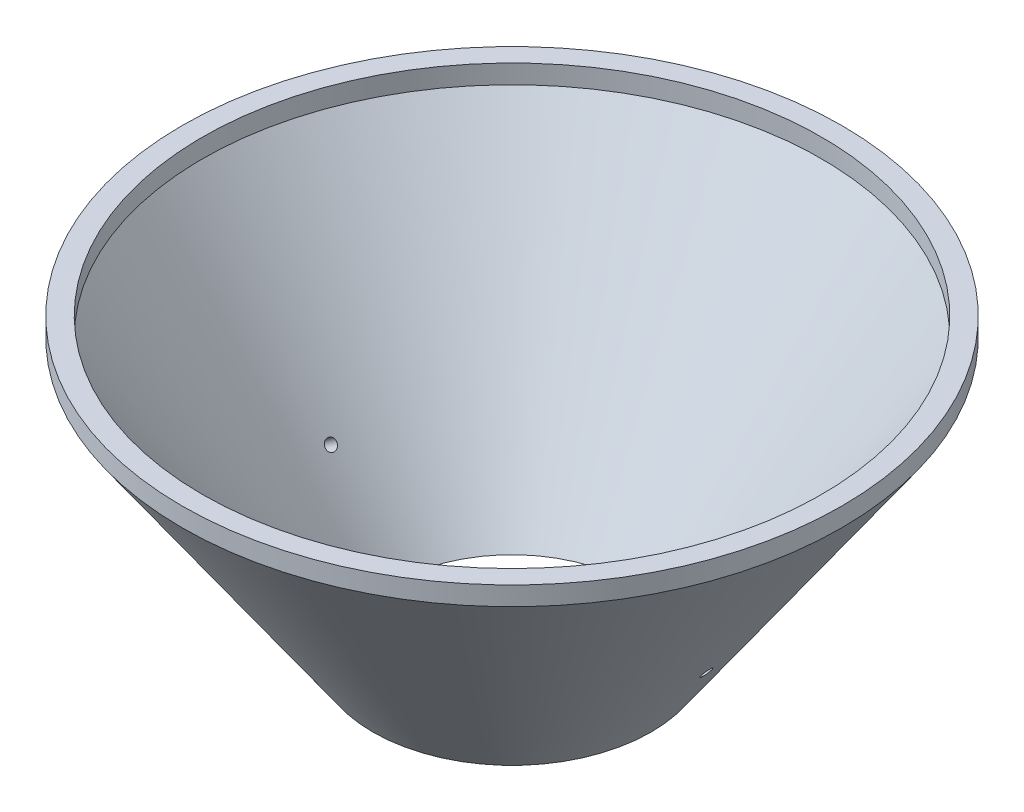
ISO-10303-21;
HEADER;
FILE_DESCRIPTION(('STEP AP214'),'2;1');
FILE_NAME('part.step','',(''),(''),'','','');
FILE_SCHEMA(('AUTOMOTIVE_DESIGN { 1 0 10303 214 1 1 1 1 }'));
ENDSEC;
DATA;
#1=APPLICATION_CONTEXT('core data for automotive mechanical design processes');
#2=APPLICATION_PROTOCOL_DEFINITION('international standard','automotive_design',2000,#1);
#3=PRODUCT_CONTEXT('',#1,'mechanical');
#4=PRODUCT('Part','Part','',(#3));
#5=PRODUCT_RELATED_PRODUCT_CATEGORY('part','',(#4));
#6=PRODUCT_DEFINITION_FORMATION('','',#4);
#7=PRODUCT_DEFINITION_CONTEXT('part definition',#1,'design');
#8=PRODUCT_DEFINITION('design','',#6,#7);
#9=PRODUCT_DEFINITION_SHAPE('','',#8);
#10=(LENGTH_UNIT() NAMED_UNIT(*) SI_UNIT(.MILLI.,.METRE.));
#11=(NAMED_UNIT(*) PLANE_ANGLE_UNIT() SI_UNIT($,.RADIAN.));
#12=(NAMED_UNIT(*) SI_UNIT($,.STERADIAN.) SOLID_ANGLE_UNIT());
#13=UNCERTAINTY_MEASURE_WITH_UNIT(LENGTH_MEASURE(1.E-05),#10,'distance_accuracy_value','');
#14=(GEOMETRIC_REPRESENTATION_CONTEXT(3) GLOBAL_UNCERTAINTY_ASSIGNED_CONTEXT((#13)) GLOBAL_UNIT_ASSIGNED_CONTEXT((#10,
#11,#12)) REPRESENTATION_CONTEXT('',''));
#15=CARTESIAN_POINT('',(0.,0.,0.));
#16=DIRECTION('',(0.,0.,1.));
#17=DIRECTION('',(1.,0.,0.));
#18=AXIS2_PLACEMENT_3D('',#15,#16,#17);
#19=CARTESIAN_POINT('',(0.,0.,0.));
#20=DIRECTION('',(0.,1.,0.));
#21=DIRECTION('',(0.,0.,1.));
#22=AXIS2_PLACEMENT_3D('',#19,#20,#21);
#23=CONICAL_SURFACE('',#22,12.63,0.610865238198013);
#24=CARTESIAN_POINT('',(18.9409920304637,9.0174198213227,-0.341221752310357));
#25=CARTESIAN_POINT('',(18.9516528807942,9.03335579514401,-0.368943909328451));
#26=CARTESIAN_POINT('',(18.9636435000784,9.05123552282013,-0.395067037450147));
#27=CARTESIAN_POINT('',(18.9899743840398,9.09035338379973,-0.443349914106763));
#28=CARTESIAN_POINT('',(19.0043174497796,9.1115955196641,-0.46550487112919));
#29=CARTESIAN_POINT('',(19.0349633828263,9.15679390072063,-0.50518849983412));
#30=CARTESIAN_POINT('',(19.0512653268974,9.18074886702915,-0.522719338550814));
#31=CARTESIAN_POINT('',(19.0853931640646,9.23067439551349,-0.552662840553578));
#32=CARTESIAN_POINT('',(19.1032186768391,9.25664445452258,-0.565076776669664));
#33=CARTESIAN_POINT('',(19.1399109995928,9.30985368090246,-0.584440567537121));
#34=CARTESIAN_POINT('',(19.1587777706456,9.33709280082461,-0.591390626402793));
#35=CARTESIAN_POINT('',(19.1970293725544,9.3920606076407,-0.599629592854147));
#36=CARTESIAN_POINT('',(19.2164142227705,9.41978931281673,-0.60091828858248));
#37=CARTESIAN_POINT('',(19.2551462793119,9.47493881765334,-0.597797819956837));
#38=CARTESIAN_POINT('',(19.2744934948745,9.50235970373208,-0.5933902972853));
#39=CARTESIAN_POINT('',(19.3125978896348,9.55612948038676,-0.57900559997575));
#40=CARTESIAN_POINT('',(19.3313550697851,9.58247837269348,-0.569028434330533));
#41=CARTESIAN_POINT('',(19.3677306271828,9.6333705038294,-0.543787270498572));
#42=CARTESIAN_POINT('',(19.3853489389023,9.65791363877063,-0.528522968422768));
#43=CARTESIAN_POINT('',(19.418921477716,9.70451373168668,-0.493141031359008));
#44=CARTESIAN_POINT('',(19.4348757045594,9.72657068928652,-0.473023395639035));
#45=CARTESIAN_POINT('',(19.4646436210162,9.76759906631192,-0.428498929059879));
#46=CARTESIAN_POINT('',(19.478456690162,9.78656959142533,-0.4040908592689));
#47=CARTESIAN_POINT('',(19.5035154908795,9.82089977862868,-0.351681822803493));
#48=CARTESIAN_POINT('',(19.5147612184523,9.83625943509415,-0.323680850532673));
#49=CARTESIAN_POINT('',(19.5343397661102,9.86295178733934,-0.264878076519695));
#50=CARTESIAN_POINT('',(19.542672364744,9.87428417697388,-0.234076062071064));
#51=CARTESIAN_POINT('',(19.5561648101363,9.89261354016702,-0.170547348437315));
#52=CARTESIAN_POINT('',(19.5613246634901,9.89961052273778,-0.137820653253258));
#53=CARTESIAN_POINT('',(19.5683097414493,9.90907886567705,-0.0713802071735974));
#54=CARTESIAN_POINT('',(19.5701357893078,9.9115513433315,-0.0376667020516758));
#55=CARTESIAN_POINT('',(19.5703986409376,9.91190736541768,0.0297977072534086));
#56=CARTESIAN_POINT('',(19.5688354486134,9.90979091513603,0.0635486113934413));
#57=CARTESIAN_POINT('',(19.5623693554034,9.90102703926073,0.130123075161604));
#58=CARTESIAN_POINT('',(19.5574670852682,9.89438046940477,0.16294680871252));
#59=CARTESIAN_POINT('',(19.5444764066079,9.87673666923223,0.226742209433611));
#60=CARTESIAN_POINT('',(19.5363879948134,9.86573943445126,0.257713874703264));
#61=CARTESIAN_POINT('',(19.5172744794256,9.83968964124902,0.316931433895236));
#62=CARTESIAN_POINT('',(19.5062489125108,9.82463644301547,0.345176896814268));
#63=CARTESIAN_POINT('',(19.4816012673562,9.79088395687603,0.398135619957056));
#64=CARTESIAN_POINT('',(19.4679791843011,9.77218466220844,0.422848873630181));
#65=CARTESIAN_POINT('',(19.4385502170128,9.73164438878141,0.468048391004436));
#66=CARTESIAN_POINT('',(19.4227427576482,9.70980258293727,0.488533538434191));
#67=CARTESIAN_POINT('',(19.3894229293304,9.66358050446548,0.52468719199105));
#68=CARTESIAN_POINT('',(19.3719105610265,9.63920023280481,0.540355699952948));
#69=CARTESIAN_POINT('',(19.3357034543183,9.58857652416262,0.566430488966749));
#70=CARTESIAN_POINT('',(19.3170087596836,9.56233315614849,0.576836964690844));
#71=CARTESIAN_POINT('',(19.278985518405,9.50871473112502,0.592092607309416));
#72=CARTESIAN_POINT('',(19.2596569727668,9.48133967591143,0.596941783021795));
#73=CARTESIAN_POINT('',(19.2209301853392,9.4262367058419,0.600944259560997));
#74=CARTESIAN_POINT('',(19.2015319651402,9.39850889449174,0.600099194398644));
#75=CARTESIAN_POINT('',(19.1632107021641,9.34348033562615,0.592741075740981));
#76=CARTESIAN_POINT('',(19.1442876585822,9.31617958738738,0.586228031846972));
#77=CARTESIAN_POINT('',(19.1074451751407,9.26279002378878,0.567720083972553));
#78=CARTESIAN_POINT('',(19.0895256394528,9.23670109274913,0.555725704428883));
#79=CARTESIAN_POINT('',(19.0551769514751,9.18648596264801,0.526595960401006));
#80=CARTESIAN_POINT('',(19.0387478044656,9.16235977054041,0.50946057770349));
#81=CARTESIAN_POINT('',(19.0078154886344,9.11676697764842,0.470530262506523));
#82=CARTESIAN_POINT('',(18.9933127988557,9.09530103846516,0.44873417455488));
#83=CARTESIAN_POINT('',(18.9666191084016,9.05566563167151,0.401103215934936));
#84=CARTESIAN_POINT('',(18.954428115545,9.03749617521055,0.375268331607078));
#85=CARTESIAN_POINT('',(18.932670497573,9.00498708154816,0.320286275363405));
#86=CARTESIAN_POINT('',(18.9231044593827,8.99064830088309,0.29113836473067));
#87=CARTESIAN_POINT('',(18.9068448344701,8.9662330439194,0.230363159170827));
#88=CARTESIAN_POINT('',(18.9001511322964,8.95615639630751,0.198735963957302));
#89=CARTESIAN_POINT('',(18.8898061164297,8.94056790092257,0.133908223698161));
#90=CARTESIAN_POINT('',(18.8861539701373,8.93505480391981,0.100708111856573));
#91=CARTESIAN_POINT('',(18.8819804712424,8.92875382241925,0.0336597777743034));
#92=CARTESIAN_POINT('',(18.8814598860175,8.92796709610127,-0.00018860128355528));
#93=CARTESIAN_POINT('',(18.8835636636255,8.93114416410418,-0.0675665199245226));
#94=CARTESIAN_POINT('',(18.8861886374448,8.93510888133485,-0.101095996289468));
#95=CARTESIAN_POINT('',(18.8945180001919,8.94767030676081,-0.166851548132623));
#96=CARTESIAN_POINT('',(18.9002187055197,8.95626147413967,-0.199079133274328));
#97=CARTESIAN_POINT('',(18.9118670403593,8.97377563061058,-0.249700905151459));
#98=CARTESIAN_POINT('',(18.9169294507424,8.98137959517991,-0.268771196420281));
#99=CARTESIAN_POINT('',(18.9281511365663,8.9982078066753,-0.305844279334317));
#100=CARTESIAN_POINT('',(18.9343104119751,9.00743205355399,-0.323847071010732));
#101=CARTESIAN_POINT('',(18.9409920304637,9.0174198213227,-0.341221752310357));
#102=B_SPLINE_CURVE_WITH_KNOTS('',3,(#24,#25,#26,#27,#28,#29,#30,#31,#32,#33,#34,#35,#36,#37,
#38,#39,#40,#41,#42,#43,#44,#45,#46,#47,#48,#49,#50,#51,#52,#53,#54,#55,#56,#57,#58,#59,#60,#61,
#62,#63,#64,#65,#66,#67,#68,#69,#70,#71,#72,#73,#74,#75,#76,#77,#78,#79,#80,#81,#82,#83,#84,#85,
#86,#87,#88,#89,#90,#91,#92,#93,#94,#95,#96,#97,#98,#99,#100,#101),.UNSPECIFIED.,.T.,.F.,(4,2,2,
2,2,2,2,2,2,2,2,2,2,2,2,2,2,2,2,2,2,2,2,2,2,2,2,2,2,2,2,2,2,2,2,2,2,2,4),(0.,0.10104235923319,
0.202205915079846,0.303321977342182,0.404412871772923,0.505499989567226,0.60659089017245,
0.707652662303126,0.808714271259004,0.909781689903222,1.01084912379122,1.11194579061356,
1.21304261490842,1.31414712274877,1.41525142041871,1.51633074791722,1.61740995896861,
1.71847008148962,1.81953030771289,1.9206064851317,2.02168284999809,2.12278586621353,
2.22388884391595,2.32498808097644,2.42608715762013,2.52715722426009,2.62822711969221,
2.72928734710247,2.83034793254847,2.93143360139531,3.03251961213003,3.13362820674222,
3.23473273698328,3.33580958163436,3.43691119378623,3.53803244687288,3.63903286168514,
3.70236050388859,3.76568814424114),.UNSPECIFIED.);
#103=CARTESIAN_POINT('',(18.9409920304637,9.0174198213227,-0.341221752310357));
#104=VERTEX_POINT('',#103);
#105=EDGE_CURVE('E58',#104,#104,#102,.T.);
#106=ORIENTED_EDGE('',*,*,#105,.T.);
#107=EDGE_LOOP('',(#106));
#108=FACE_BOUND('',#107,.T.);
#109=CARTESIAN_POINT('',(0.,28.8966390184844,0.));
#110=DIRECTION('',(0.,1.,0.));
#111=DIRECTION('',(0.,0.,1.));
#112=AXIS2_PLACEMENT_3D('',#109,#110,#111);
#113=CIRCLE('',#112,32.8636444696675);
#114=CARTESIAN_POINT('',(0.,28.8966390184844,32.8636444696675));
#115=VERTEX_POINT('',#114);
#116=EDGE_CURVE('E99',#115,#115,#113,.T.);
#117=ORIENTED_EDGE('',*,*,#116,.T.);
#118=EDGE_LOOP('',(#117));
#119=FACE_BOUND('',#118,.T.);
#120=CARTESIAN_POINT('',(0.,0.,0.));
#121=DIRECTION('',(0.,1.,0.));
#122=DIRECTION('',(0.,0.,1.));
#123=AXIS2_PLACEMENT_3D('',#120,#121,#122);
#124=CIRCLE('',#123,12.63);
#125=CARTESIAN_POINT('',(0.,0.,12.63));
#126=VERTEX_POINT('',#125);
#127=EDGE_CURVE('E10',#126,#126,#124,.T.);
#128=ORIENTED_EDGE('',*,*,#127,.F.);
#129=EDGE_LOOP('',(#128));
#130=FACE_BOUND('',#129,.T.);
#131=CARTESIAN_POINT('',(-19.4175885176777,9.70263879091387,-0.493584225455072));
#132=CARTESIAN_POINT('',(-19.401358281771,9.68016229249148,-0.512741554706572));
#133=CARTESIAN_POINT('',(-19.3842083219253,9.6563303550641,-0.529572307843523));
#134=CARTESIAN_POINT('',(-19.3485868387306,9.60662035558906,-0.558080314798091));
#135=CARTESIAN_POINT('',(-19.3301137610521,9.58073988315152,-0.569751387967737));
#136=CARTESIAN_POINT('',(-19.2924106182585,9.52768117822797,-0.587585099760744));
#137=CARTESIAN_POINT('',(-19.2731809071034,9.5005035513244,-0.593750282841554));
#138=CARTESIAN_POINT('',(-19.2345210675658,9.44561254210044,-0.60040235203029));
#139=CARTESIAN_POINT('',(-19.2150909900072,9.41789929415578,-0.60089064429087));
#140=CARTESIAN_POINT('',(-19.1765805091088,9.36271767045297,-0.596179631487159));
#141=CARTESIAN_POINT('',(-19.1575000758947,9.33524927387818,-0.590980814666784));
#142=CARTESIAN_POINT('',(-19.1202199661323,9.28133946924398,-0.575043678832522));
#143=CARTESIAN_POINT('',(-19.1020203243432,9.25489810172281,-0.564305141396735));
#144=CARTESIAN_POINT('',(-19.0670007646207,9.20380503618891,-0.537593195567367));
#145=CARTESIAN_POINT('',(-19.0501808948431,9.17915340064377,-0.521619604560233));
#146=CARTESIAN_POINT('',(-19.0183735379543,9.1323573899341,-0.484891136578403));
#147=CARTESIAN_POINT('',(-19.0033860509059,9.11021301485563,-0.464136259439587));
#148=CARTESIAN_POINT('',(-18.9756344886406,9.06907390168621,-0.418427061129773));
#149=CARTESIAN_POINT('',(-18.9628710739623,9.05008009938014,-0.393471496686931));
#150=CARTESIAN_POINT('',(-18.939904237595,9.01581068222032,-0.340073127500658));
#151=CARTESIAN_POINT('',(-18.9297008124928,9.00053506240915,-0.311630327406787));
#152=CARTESIAN_POINT('',(-18.9121143372266,8.97415475073057,-0.252062134454907));
#153=CARTESIAN_POINT('',(-18.9047314879638,8.963050355968,-0.220936550703678));
#154=CARTESIAN_POINT('',(-18.892974144582,8.94534574379358,-0.156888039060695));
#155=CARTESIAN_POINT('',(-18.8885996478745,8.93874552250618,-0.123965112715464));
#156=CARTESIAN_POINT('',(-18.8829697752905,8.93024833907432,-0.0572661068152085));
#157=CARTESIAN_POINT('',(-18.88171355048,8.92835009683969,-0.0234902619930935));
#158=CARTESIAN_POINT('',(-18.8823492238672,8.92931015662237,0.0439640183005182));
#159=CARTESIAN_POINT('',(-18.884241116928,8.93216845087811,0.0776424539308742));
#160=CARTESIAN_POINT('',(-18.8911249580144,8.94255477241331,0.143939432796078));
#161=CARTESIAN_POINT('',(-18.8961163315958,8.95008193438496,0.176558171252002));
#162=CARTESIAN_POINT('',(-18.9090730812844,8.96957984270636,0.239816878822746));
#163=CARTESIAN_POINT('',(-18.9170384619207,8.9815505958233,0.270456844923987));
#164=CARTESIAN_POINT('',(-18.9357432063248,9.00958157393837,0.328894924715401));
#165=CARTESIAN_POINT('',(-18.9464831155053,9.02564260298794,0.35669247814703));
#166=CARTESIAN_POINT('',(-18.970460820221,9.06137671622385,0.4086507102759));
#167=CARTESIAN_POINT('',(-18.9836986200892,9.08104980667595,0.432811382664185));
#168=CARTESIAN_POINT('',(-19.0123315442464,9.12343413798413,0.476816578324767));
#169=CARTESIAN_POINT('',(-19.0277272398111,9.14614618329266,0.496659955085495));
#170=CARTESIAN_POINT('',(-19.0602655580122,9.19393973603782,0.531459066221772));
#171=CARTESIAN_POINT('',(-19.0774081796317,9.2190212420951,0.546414803442524));
#172=CARTESIAN_POINT('',(-19.1129760667955,9.27082307710547,0.571012621441635));
#173=CARTESIAN_POINT('',(-19.1314012238735,9.29754326744929,0.580655150954382));
#174=CARTESIAN_POINT('',(-19.1690280768323,9.35185460362497,0.594354225016952));
#175=CARTESIAN_POINT('',(-19.1882297710721,9.37944574761612,0.598410781371617));
#176=CARTESIAN_POINT('',(-19.2268647405924,9.434702791546,0.600822152710127));
#177=CARTESIAN_POINT('',(-19.2462979461925,9.46236866714562,0.599178642151331));
#178=CARTESIAN_POINT('',(-19.2848457570536,9.51700060842801,0.590240368933641));
#179=CARTESIAN_POINT('',(-19.3039603622603,9.54396667399159,0.582945605312336));
#180=CARTESIAN_POINT('',(-19.3413141486674,9.59644210410574,0.562912646850214));
#181=CARTESIAN_POINT('',(-19.3595533642712,9.62195152591124,0.550174666127982));
#182=CARTESIAN_POINT('',(-19.3946183905132,9.67080636420266,0.51961711258294));
#183=CARTESIAN_POINT('',(-19.4114442000467,9.69415177899725,0.501797535788529));
#184=CARTESIAN_POINT('',(-19.4431827994753,9.73804158398757,0.461576916617099));
#185=CARTESIAN_POINT('',(-19.4580950704815,9.75858521452563,0.439174635815023));
#186=CARTESIAN_POINT('',(-19.4855489809308,9.79630193869703,0.390427016085139));
#187=CARTESIAN_POINT('',(-19.4980906135772,9.8134750226669,0.364081665852811));
#188=CARTESIAN_POINT('',(-19.5204205628929,9.8439857706707,0.308190656279575));
#189=CARTESIAN_POINT('',(-19.5302084420283,9.85732282521922,0.2786444894042));
#190=CARTESIAN_POINT('',(-19.5467254797967,9.87979628462473,0.217193693033975));
#191=CARTESIAN_POINT('',(-19.5534546363181,9.88893268658159,0.185289061910854));
#192=CARTESIAN_POINT('',(-19.5636438208904,9.90275656631891,0.120032900465693));
#193=CARTESIAN_POINT('',(-19.5671044128359,9.90744481149837,0.0866816207590241));
#194=CARTESIAN_POINT('',(-19.5706501951097,9.91224837987877,0.0194754291026961));
#195=CARTESIAN_POINT('',(-19.5707355226306,9.9123638889451,-0.0143794623209883));
#196=CARTESIAN_POINT('',(-19.5675291615335,9.90802030192253,-0.0816206311640796));
#197=CARTESIAN_POINT('',(-19.5642386524977,9.90356280373027,-0.115007068139819));
#198=CARTESIAN_POINT('',(-19.5543834728714,9.89019352288147,-0.180384920454303));
#199=CARTESIAN_POINT('',(-19.5478179925184,9.88128063859445,-0.212375988648697));
#200=CARTESIAN_POINT('',(-19.531614290467,9.8592374837752,-0.274060674640528));
#201=CARTESIAN_POINT('',(-19.5219743808316,9.84610489649272,-0.303753019227275));
#202=CARTESIAN_POINT('',(-19.499927230821,9.81598787016023,-0.359954749885987));
#203=CARTESIAN_POINT('',(-19.4875233058232,9.79900804538287,-0.386467891226359));
#204=CARTESIAN_POINT('',(-19.4654082770515,9.76863542846856,-0.426421010043452));
#205=CARTESIAN_POINT('',(-19.4564143963297,9.75626138418274,-0.44105271640314));
#206=CARTESIAN_POINT('',(-19.4375972560163,9.73031576317857,-0.46862311899238));
#207=CARTESIAN_POINT('',(-19.4277739961247,9.716744186027,-0.481561814609454));
#208=CARTESIAN_POINT('',(-19.4175885176777,9.70263879091387,-0.493584225455072));
#209=B_SPLINE_CURVE_WITH_KNOTS('',3,(#131,#132,#133,#134,#135,#136,#137,#138,#139,#140,#141,
#142,#143,#144,#145,#146,#147,#148,#149,#150,#151,#152,#153,#154,#155,#156,#157,#158,#159,#160,
#161,#162,#163,#164,#165,#166,#167,#168,#169,#170,#171,#172,#173,#174,#175,#176,#177,#178,#179,
#180,#181,#182,#183,#184,#185,#186,#187,#188,#189,#190,#191,#192,#193,#194,#195,#196,#197,#198,
#199,#200,#201,#202,#203,#204,#205,#206,#207,#208),.UNSPECIFIED.,.T.,.F.,(4,2,2,2,2,2,2,2,2,2,2,
2,2,2,2,2,2,2,2,2,2,2,2,2,2,2,2,2,2,2,2,2,2,2,2,2,2,2,4),(0.,0.101019596238331,
0.202159875524667,0.303253390254799,0.404321863822779,0.505381661243669,0.606445443587614,
0.707512751698962,0.808580063279502,0.909677340383719,1.01077448269558,1.11187882451312,
1.21298307933683,1.31405980600863,1.41513636774675,1.5161942019858,1.61725219012765,
1.7183300592329,1.81940810367752,1.92051295797901,2.02161775342502,2.12271400861483,
2.2238100501575,2.32487639614162,2.42594275933736,2.52700514727461,2.62806761419894,
2.72915742830185,2.83024753222815,2.9313536889381,3.0324599154519,3.13354869587807,
3.23463336740189,3.3356827300244,3.43675709029216,3.53788703867084,3.63889633062107,
3.70229236219331,3.76568841670026),.UNSPECIFIED.);
#210=CARTESIAN_POINT('',(-19.4175885176777,9.70263879091387,-0.493584225455072));
#211=VERTEX_POINT('',#210);
#212=EDGE_CURVE('E59',#211,#211,#209,.T.);
#213=ORIENTED_EDGE('',*,*,#212,.T.);
#214=EDGE_LOOP('',(#213));
#215=FACE_BOUND('',#214,.T.);
#216=ADVANCED_FACE('F33',(#108,#119,#130,#215),#23,.F.);
#217=CARTESIAN_POINT('',(0.,0.,0.));
#218=DIRECTION('',(0.,1.,0.));
#219=DIRECTION('',(0.,0.,1.));
#220=AXIS2_PLACEMENT_3D('',#217,#218,#219);
#221=CONICAL_SURFACE('',#220,14.7663555303325,0.610865238198012);
#222=CARTESIAN_POINT('',(20.3646257418339,7.99860651391928,-0.313593840717819));
#223=CARTESIAN_POINT('',(20.3744343438878,8.01324488529913,-0.342327435015164));
#224=CARTESIAN_POINT('',(20.3856167474971,8.02989913018217,-0.369593761873281));
#225=CARTESIAN_POINT('',(20.4104399436358,8.06674805707651,-0.420394020488726));
#226=CARTESIAN_POINT('',(20.4240836718413,8.08694696609483,-0.44392343143446));
#227=CARTESIAN_POINT('',(20.4534586929197,8.13027316971064,-0.486546614066901));
#228=CARTESIAN_POINT('',(20.4691889955729,8.15339907501456,-0.505642478019865));
#229=CARTESIAN_POINT('',(20.5023169723511,8.20190436940032,-0.538862493169259));
#230=CARTESIAN_POINT('',(20.5197142307754,8.22728319653915,-0.552987879805548));
#231=CARTESIAN_POINT('',(20.5557073827238,8.27956519424268,-0.575873503193388));
#232=CARTESIAN_POINT('',(20.5743032960704,8.30646839001536,-0.58463365119345));
#233=CARTESIAN_POINT('',(20.6121795392711,8.36102643335326,-0.596539259161205));
#234=CARTESIAN_POINT('',(20.631459894786,8.38868130909077,-0.599684508392101));
#235=CARTESIAN_POINT('',(20.6701557836906,8.44394575322748,-0.600270195230751));
#236=CARTESIAN_POINT('',(20.6895712793268,8.4715553318123,-0.597712167033927));
#237=CARTESIAN_POINT('',(20.7279862067802,8.5259563910139,-0.586967209719012));
#238=CARTESIAN_POINT('',(20.7469856394448,8.55274787329709,-0.578780292067463));
#239=CARTESIAN_POINT('',(20.7840152840696,8.60476203171781,-0.557010343433888));
#240=CARTESIAN_POINT('',(20.8020455018826,8.62998471732913,-0.54342734504184));
#241=CARTESIAN_POINT('',(20.8366044586636,8.67816070305206,-0.51125097380592));
#242=CARTESIAN_POINT('',(20.8531331978689,8.70111400352252,-0.492657601754307));
#243=CARTESIAN_POINT('',(20.8841987170403,8.74412361888771,-0.450982920516346));
#244=CARTESIAN_POINT('',(20.8987350120423,8.76417922854395,-0.427900521989123));
#245=CARTESIAN_POINT('',(20.9253710995246,8.80083715302826,-0.377905474256444));
#246=CARTESIAN_POINT('',(20.9374708875382,8.81743946152567,-0.35099281802944));
#247=CARTESIAN_POINT('',(20.9588655448789,8.84673969031555,-0.294097336914541));
#248=CARTESIAN_POINT('',(20.9681600870118,8.85943715516373,-0.264114154436825));
#249=CARTESIAN_POINT('',(20.9836560560249,8.88057989454031,-0.201931212780649));
#250=CARTESIAN_POINT('',(20.9898574880178,8.88902517609707,-0.169731457266028));
#251=CARTESIAN_POINT('',(20.9989742878654,8.90143337614751,-0.104035686245605));
#252=CARTESIAN_POINT('',(21.0018902593176,8.9053971179801,-0.0705399100118087));
#253=CARTESIAN_POINT('',(21.0043475534234,8.90873767881325,-0.00319769713412559));
#254=CARTESIAN_POINT('',(21.003888880198,8.90811450341516,0.0306487390814979));
#255=CARTESIAN_POINT('',(20.9996115950352,8.90229870059334,0.0977243518888984));
#256=CARTESIAN_POINT('',(20.9957936525326,8.89710698358786,0.13095365011671));
#257=CARTESIAN_POINT('',(20.9849172790368,8.88229592391954,0.195858845662271));
#258=CARTESIAN_POINT('',(20.9778588462005,8.87267657873838,0.227534742096473));
#259=CARTESIAN_POINT('',(20.960718928486,8.84927002847987,0.288437268161337));
#260=CARTESIAN_POINT('',(20.950637170308,8.83548244660512,0.317663676059621));
#261=CARTESIAN_POINT('',(20.9277605465319,8.80411457644837,0.372835182350648));
#262=CARTESIAN_POINT('',(20.9149656763164,8.78653428171135,0.398780275158621));
#263=CARTESIAN_POINT('',(20.8870492210188,8.74805615976471,0.446659237136265));
#264=CARTESIAN_POINT('',(20.8719270737375,8.72715753090785,0.468592134272271));
#265=CARTESIAN_POINT('',(20.839814604028,8.6826195867298,0.507816561048643));
#266=CARTESIAN_POINT('',(20.8228242815663,8.65898027135959,0.525108090605989));
#267=CARTESIAN_POINT('',(20.7874818124333,8.60961387845502,0.554559090138702));
#268=CARTESIAN_POINT('',(20.7691296370785,8.58388675694614,0.566718451984054));
#269=CARTESIAN_POINT('',(20.7316040399698,8.53106203185536,0.58555895241195));
#270=CARTESIAN_POINT('',(20.7124306192337,8.50396442997189,0.592240097783398));
#271=CARTESIAN_POINT('',(20.6738233200193,8.44916668488328,0.599933212594806));
#272=CARTESIAN_POINT('',(20.6543895043348,8.42146668597575,0.60094652500806));
#273=CARTESIAN_POINT('',(20.615811434259,8.36624268458528,0.597278746399772));
#274=CARTESIAN_POINT('',(20.5966671793034,8.3387186817594,0.592597666477808));
#275=CARTESIAN_POINT('',(20.5592073991926,8.28463647425992,0.577675233862602));
#276=CARTESIAN_POINT('',(20.5408917650964,8.25807814271755,0.567434614412036));
#277=CARTESIAN_POINT('',(20.5055905077935,8.20668784739393,0.541684528567403));
#278=CARTESIAN_POINT('',(20.4886048886767,8.18185588892137,0.526175045972146));
#279=CARTESIAN_POINT('',(20.4564197361893,8.13463426564631,0.490324264615791));
#280=CARTESIAN_POINT('',(20.4412205258439,8.11224504260079,0.469982093992853));
#281=CARTESIAN_POINT('',(20.413015405851,8.07056806824276,0.425044550728488));
#282=CARTESIAN_POINT('',(20.4000095037669,8.05128032762535,0.400449163420934));
#283=CARTESIAN_POINT('',(20.3765284098293,8.01636954504959,0.347696639468549));
#284=CARTESIAN_POINT('',(20.3660538045121,8.00074735247338,0.319538679625137));
#285=CARTESIAN_POINT('',(20.3479100737971,7.97363640996757,0.26046552786247));
#286=CARTESIAN_POINT('',(20.3402408369851,7.96214749588677,0.229550445501892));
#287=CARTESIAN_POINT('',(20.3279044906012,7.94364577132801,0.165846255703091));
#288=CARTESIAN_POINT('',(20.3232367795893,7.93663206411907,0.133057525137501));
#289=CARTESIAN_POINT('',(20.3170190581752,7.92728573641098,0.0665219009624295));
#290=CARTESIAN_POINT('',(20.3154698131609,7.92495426510772,0.0327747741873072));
#291=CARTESIAN_POINT('',(20.3155295223925,7.92504407904279,-0.0347144968868515));
#292=CARTESIAN_POINT('',(20.3171391624374,7.92746639633634,-0.0684566385131055));
#293=CARTESIAN_POINT('',(20.3234773240445,7.93699351686731,-0.134944461848816));
#294=CARTESIAN_POINT('',(20.3282021112012,7.9440927135029,-0.167691287622289));
#295=CARTESIAN_POINT('',(20.338311855909,7.95925407814073,-0.219381640572556));
#296=CARTESIAN_POINT('',(20.3427916214685,7.96596697038247,-0.238913715864951));
#297=CARTESIAN_POINT('',(20.3528764865672,7.98105841498437,-0.277020384560361));
#298=CARTESIAN_POINT('',(20.358481585993,7.98943696717642,-0.295594978060007));
#299=CARTESIAN_POINT('',(20.3646257418339,7.99860651391928,-0.313593840717819));
#300=B_SPLINE_CURVE_WITH_KNOTS('',3,(#222,#223,#224,#225,#226,#227,#228,#229,#230,#231,#232,
#233,#234,#235,#236,#237,#238,#239,#240,#241,#242,#243,#244,#245,#246,#247,#248,#249,#250,#251,
#252,#253,#254,#255,#256,#257,#258,#259,#260,#261,#262,#263,#264,#265,#266,#267,#268,#269,#270,
#271,#272,#273,#274,#275,#276,#277,#278,#279,#280,#281,#282,#283,#284,#285,#286,#287,#288,#289,
#290,#291,#292,#293,#294,#295,#296,#297,#298,#299),.UNSPECIFIED.,.T.,.F.,(4,2,2,2,2,2,2,2,2,2,2,
2,2,2,2,2,2,2,2,2,2,2,2,2,2,2,2,2,2,2,2,2,2,2,2,2,2,2,4),(0.,0.101041639126829,
0.202204599361212,0.303319721592977,0.404409693314889,0.505501337216546,0.606596775181529,
0.707665021510438,0.808733061955062,0.909800492002022,1.01086790606785,1.11195987658344,
1.2130520324211,1.31415597474787,1.41525974996103,1.51634494758463,1.61743002176691,
1.7184949562923,1.81955994830102,1.92063407904673,2.02170838181741,2.12280713949769,
2.22390589898632,2.32500678842579,2.42610755257537,2.52718436023562,2.62826097087605,
2.7293242538505,2.83038784758651,2.93146968799868,3.03255187697262,3.13365746566846,
3.23475903856044,3.33584034659975,3.43694646074371,3.53807452761748,3.6390815831203,
3.7023745617183,3.7656675339286),.UNSPECIFIED.);
#301=CARTESIAN_POINT('',(20.3646257418339,7.99860651391928,-0.313593840717819));
#302=VERTEX_POINT('',#301);
#303=EDGE_CURVE('E53',#302,#302,#300,.T.);
#304=ORIENTED_EDGE('',*,*,#303,.F.);
#305=EDGE_LOOP('',(#304));
#306=FACE_BOUND('',#305,.T.);
#307=CARTESIAN_POINT('',(0.,28.8966390184844,0.));
#308=DIRECTION('',(0.,1.,0.));
#309=DIRECTION('',(0.,0.,1.));
#310=AXIS2_PLACEMENT_3D('',#307,#308,#309);
#311=CIRCLE('',#310,35.);
#312=CARTESIAN_POINT('',(0.,28.8966390184844,35.));
#313=VERTEX_POINT('',#312);
#314=EDGE_CURVE('E50',#313,#313,#311,.T.);
#315=ORIENTED_EDGE('',*,*,#314,.F.);
#316=EDGE_LOOP('',(#315));
#317=FACE_BOUND('',#316,.T.);
#318=CARTESIAN_POINT('',(0.,0.,0.));
#319=DIRECTION('',(0.,1.,0.));
#320=DIRECTION('',(0.,0.,1.));
#321=AXIS2_PLACEMENT_3D('',#318,#319,#320);
#322=CIRCLE('',#321,14.7663555303325);
#323=CARTESIAN_POINT('',(0.,0.,14.7663555303325));
#324=VERTEX_POINT('',#323);
#325=EDGE_CURVE('E45',#324,#324,#322,.T.);
#326=ORIENTED_EDGE('',*,*,#325,.T.);
#327=EDGE_LOOP('',(#326));
#328=FACE_BOUND('',#327,.T.);
#329=CARTESIAN_POINT('',(-20.7680642893964,8.58235560423536,-0.566368961277092));
#330=CARTESIAN_POINT('',(-20.749613410231,8.55644767668777,-0.577489594845832));
#331=CARTESIAN_POINT('',(-20.7306531021531,8.52972170624524,-0.585933144958866));
#332=CARTESIAN_POINT('',(-20.6922747795208,8.47539378667572,-0.597206713387252));
#333=CARTESIAN_POINT('',(-20.6728562450322,8.44779082881943,-0.600030010779991));
#334=CARTESIAN_POINT('',(-20.6341414179317,8.39252112202364,-0.599969535121633));
#335=CARTESIAN_POINT('',(-20.6148450719748,8.36485440931968,-0.59708845369544));
#336=CARTESIAN_POINT('',(-20.5769164274888,8.31024245742047,-0.585706089715172));
#337=CARTESIAN_POINT('',(-20.5582839667085,8.28329704234878,-0.577206190446914));
#338=CARTESIAN_POINT('',(-20.5221913620596,8.23089073975188,-0.554828477556887));
#339=CARTESIAN_POINT('',(-20.5047313339309,8.20542999882312,-0.540950133899527));
#340=CARTESIAN_POINT('',(-20.4714596002592,8.15673184724251,-0.508208889712981));
#341=CARTESIAN_POINT('',(-20.455647961577,8.13349452677837,-0.48934578710572));
#342=CARTESIAN_POINT('',(-20.4260925606253,8.08991661048797,-0.44716577007873));
#343=CARTESIAN_POINT('',(-20.4123492630342,8.0695766656475,-0.423847857493619));
#344=CARTESIAN_POINT('',(-20.3872959623717,8.03239679159805,-0.373422483798685));
#345=CARTESIAN_POINT('',(-20.3759859565818,8.01555685847883,-0.346315026922637));
#346=CARTESIAN_POINT('',(-20.3560910084401,7.98587244336574,-0.289075709083573));
#347=CARTESIAN_POINT('',(-20.3475064174505,7.9730284765385,-0.258943458820932));
#348=CARTESIAN_POINT('',(-20.3332844165218,7.95172053758397,-0.196512722009932));
#349=CARTESIAN_POINT('',(-20.3276469972368,7.9432565515671,-0.164214242331372));
#350=CARTESIAN_POINT('',(-20.3194635274863,7.93096221575097,-0.0983745098388488));
#351=CARTESIAN_POINT('',(-20.3169168763889,7.92713096566823,-0.0648334997929995));
#352=CARTESIAN_POINT('',(-20.3149774342751,7.92421365522839,0.00254476867578467));
#353=CARTESIAN_POINT('',(-20.3155846420717,7.92512759308549,0.0363820269872242));
#354=CARTESIAN_POINT('',(-20.3199370899038,7.93167261252726,0.103384689533685));
#355=CARTESIAN_POINT('',(-20.3236816673069,7.93730269803175,0.136550234124109));
#356=CARTESIAN_POINT('',(-20.334213077615,7.95311056917199,0.201275606234942));
#357=CARTESIAN_POINT('',(-20.3409999117003,7.9632883565722,0.232835433132343));
#358=CARTESIAN_POINT('',(-20.3574437571258,7.98789003064677,0.293457429998673));
#359=CARTESIAN_POINT('',(-20.367101080155,8.00231437842789,0.322519328290585));
#360=CARTESIAN_POINT('',(-20.3890372470671,8.03498138515356,0.377317513566289));
#361=CARTESIAN_POINT('',(-20.4013160958208,8.05322405119271,0.403053794370792));
#362=CARTESIAN_POINT('',(-20.4281790721909,8.09299538312706,0.450477022101831));
#363=CARTESIAN_POINT('',(-20.4427637866478,8.1145248854708,0.472162935140712));
#364=CARTESIAN_POINT('',(-20.4738506182558,8.1602360131928,0.510861863601621));
#365=CARTESIAN_POINT('',(-20.4903527352087,8.18441763829693,0.527874879506664));
#366=CARTESIAN_POINT('',(-20.5248305480909,8.2347297121799,0.55674482475533));
#367=CARTESIAN_POINT('',(-20.5428062414212,8.2608601575214,0.568601763193));
#368=CARTESIAN_POINT('',(-20.5797388982273,8.31431545741766,0.586822519613348));
#369=CARTESIAN_POINT('',(-20.5986958600747,8.34164030999018,0.59318634671205));
#370=CARTESIAN_POINT('',(-20.6370574153593,8.39669472873729,0.600238997828133));
#371=CARTESIAN_POINT('',(-20.6564618956313,8.4244241919593,0.600929241098333));
#372=CARTESIAN_POINT('',(-20.695172293939,8.47950701945892,0.596618838993997));
#373=CARTESIAN_POINT('',(-20.7144782120527,8.50686038403422,0.591618198124183));
#374=CARTESIAN_POINT('',(-20.7524323894518,8.56041806168891,0.576069052494488));
#375=CARTESIAN_POINT('',(-20.7710807159454,8.58662249226037,0.565521116451288));
#376=CARTESIAN_POINT('',(-20.8071755758341,8.63715392892402,0.539177386291289));
#377=CARTESIAN_POINT('',(-20.8246221070956,8.66148093168307,0.523381582857786));
#378=CARTESIAN_POINT('',(-20.8577986800439,8.70758861574258,0.486986771794129));
#379=CARTESIAN_POINT('',(-20.8735283740969,8.72936878141009,0.466386794029475));
#380=CARTESIAN_POINT('',(-20.9027943086802,8.76977813052647,0.420969870359759));
#381=CARTESIAN_POINT('',(-20.9163305487165,8.78840731326583,0.396152923505161));
#382=CARTESIAN_POINT('',(-20.9408006392303,8.82200858772642,0.343000827253243));
#383=CARTESIAN_POINT('',(-20.9517339943533,8.83697998334933,0.31466500973935));
#384=CARTESIAN_POINT('',(-20.9706596881538,8.8628533879892,0.25528288320073));
#385=CARTESIAN_POINT('',(-20.9786520237619,8.87375539275897,0.224236571347122));
#386=CARTESIAN_POINT('',(-20.9914480888421,8.89119299245167,0.160318378851144));
#387=CARTESIAN_POINT('',(-20.9962521769662,8.89772907850563,0.127446703998305));
#388=CARTESIAN_POINT('',(-21.0025241014625,8.90625966779457,0.0608079202410377));
#389=CARTESIAN_POINT('',(-21.0039919365885,8.90825416933329,0.0270408110021721));
#390=CARTESIAN_POINT('',(-21.003545752089,8.90764765777564,-0.0404222972365439));
#391=CARTESIAN_POINT('',(-21.0016324728052,8.90504765071062,-0.074118310186469));
#392=CARTESIAN_POINT('',(-20.9944850758694,8.89532458628033,-0.140488785802967));
#393=CARTESIAN_POINT('',(-20.9892510877714,8.88820170537028,-0.173163288270532));
#394=CARTESIAN_POINT('',(-20.9756255295681,8.86962723437954,-0.23656143468454));
#395=CARTESIAN_POINT('',(-20.9672342881436,8.85817609488474,-0.267285281311919));
#396=CARTESIAN_POINT('',(-20.9475498269317,8.83125156147435,-0.325922397358351));
#397=CARTESIAN_POINT('',(-20.9362558857765,8.8157771677041,-0.353834965725939));
#398=CARTESIAN_POINT('',(-20.9111061530355,8.78121973630512,-0.406065984985597));
#399=CARTESIAN_POINT('',(-20.8972485414798,8.76213413483101,-0.430381860349515));
#400=CARTESIAN_POINT('',(-20.8674071566431,8.72089699380518,-0.474685515868501));
#401=CARTESIAN_POINT('',(-20.8514259458677,8.69874914811916,-0.49467843723661));
#402=CARTESIAN_POINT('',(-20.8240972264709,8.66073392233895,-0.523237184879305));
#403=CARTESIAN_POINT('',(-20.8132433180314,8.64560325812693,-0.533284429595316));
#404=CARTESIAN_POINT('',(-20.7910145370774,8.6145409199914,-0.551361988197479));
#405=CARTESIAN_POINT('',(-20.7796396644432,8.59860924588364,-0.559392301619688));
#406=CARTESIAN_POINT('',(-20.7680642893964,8.58235560423536,-0.566368961277092));
#407=B_SPLINE_CURVE_WITH_KNOTS('',3,(#329,#330,#331,#332,#333,#334,#335,#336,#337,#338,#339,
#340,#341,#342,#343,#344,#345,#346,#347,#348,#349,#350,#351,#352,#353,#354,#355,#356,#357,#358,
#359,#360,#361,#362,#363,#364,#365,#366,#367,#368,#369,#370,#371,#372,#373,#374,#375,#376,#377,
#378,#379,#380,#381,#382,#383,#384,#385,#386,#387,#388,#389,#390,#391,#392,#393,#394,#395,#396,
#397,#398,#399,#400,#401,#402,#403,#404,#405,#406),.UNSPECIFIED.,.T.,.F.,(4,2,2,2,2,2,2,2,2,2,2,
2,2,2,2,2,2,2,2,2,2,2,2,2,2,2,2,2,2,2,2,2,2,2,2,2,2,2,4),(0.,0.10100658783231,0.202133890988976,
0.303213488355433,0.404268210395711,0.505332893722454,0.606401674757976,0.707493128349525,
0.808584469000032,0.909688837119301,1.01079288461975,1.11187728132594,1.21296163998985,
1.3140246543801,1.41508770798178,1.51616173942233,1.61723595866462,1.71833594272705,
1.81943591633924,1.92053571163531,2.02163533915214,2.12270967572348,2.22378393228767,
2.32484782859314,2.42591190432144,2.52699640619718,2.62808093083418,2.72918467749061,
2.83028852966798,2.93138100655242,3.03247352119467,3.13354390297234,3.23461034183637,
3.33566626224958,3.43674732101305,3.53790041531474,3.63893254015758,3.70230019093128,
3.76566785628109),.UNSPECIFIED.);
#408=CARTESIAN_POINT('',(-20.7680642893964,8.58235560423536,-0.566368961277092));
#409=VERTEX_POINT('',#408);
#410=EDGE_CURVE('E37',#409,#409,#407,.T.);
#411=ORIENTED_EDGE('',*,*,#410,.F.);
#412=EDGE_LOOP('',(#411));
#413=FACE_BOUND('',#412,.T.);
#414=ADVANCED_FACE('F60',(#306,#317,#328,#413),#221,.T.);
#415=CARTESIAN_POINT('',(0.,0.,0.));
#416=DIRECTION('',(0.,1.,0.));
#417=DIRECTION('',(0.,0.,1.));
#418=AXIS2_PLACEMENT_3D('',#415,#416,#417);
#419=PLANE('',#418);
#420=ORIENTED_EDGE('',*,*,#325,.F.);
#421=EDGE_LOOP('',(#420));
#422=FACE_BOUND('',#421,.T.);
#423=ORIENTED_EDGE('',*,*,#127,.T.);
#424=EDGE_LOOP('',(#423));
#425=FACE_BOUND('',#424,.T.);
#426=ADVANCED_FACE('F66',(#422,#425),#419,.F.);
#427=CARTESIAN_POINT('',(17.5878249294663,10.5674013820359,0.));
#428=DIRECTION('',(0.819152044288993,-0.573576436351044,0.));
#429=DIRECTION('',(0.573576436351044,0.819152044288993,0.));
#430=AXIS2_PLACEMENT_3D('',#427,#428,#429);
#431=CYLINDRICAL_SURFACE('',#430,0.599999999999999);
#432=ORIENTED_EDGE('',*,*,#105,.F.);
#433=EDGE_LOOP('',(#432));
#434=FACE_BOUND('',#433,.T.);
#435=ORIENTED_EDGE('',*,*,#303,.T.);
#436=EDGE_LOOP('',(#435));
#437=FACE_BOUND('',#436,.T.);
#438=ADVANCED_FACE('F62',(#434,#437),#431,.F.);
#439=CARTESIAN_POINT('',(-17.5878249294663,10.5674013820359,0.));
#440=DIRECTION('',(-0.819152044288993,-0.573576436351044,0.));
#441=DIRECTION('',(0.573576436351044,-0.819152044288993,0.));
#442=AXIS2_PLACEMENT_3D('',#439,#440,#441);
#443=CYLINDRICAL_SURFACE('',#442,0.599999999999999);
#444=ORIENTED_EDGE('',*,*,#212,.F.);
#445=EDGE_LOOP('',(#444));
#446=FACE_BOUND('',#445,.T.);
#447=ORIENTED_EDGE('',*,*,#410,.T.);
#448=EDGE_LOOP('',(#447));
#449=FACE_BOUND('',#448,.T.);
#450=ADVANCED_FACE('F65',(#446,#449),#443,.F.);
#451=CARTESIAN_POINT('',(0.,30.8966390184844,0.));
#452=DIRECTION('',(0.,1.,0.));
#453=DIRECTION('',(0.,0.,1.));
#454=AXIS2_PLACEMENT_3D('',#451,#452,#453);
#455=PLANE('',#454);
#456=CARTESIAN_POINT('',(0.,30.8966390184844,0.));
#457=DIRECTION('',(0.,1.,0.));
#458=DIRECTION('',(0.,0.,1.));
#459=AXIS2_PLACEMENT_3D('',#456,#457,#458);
#460=CIRCLE('',#459,35.);
#461=CARTESIAN_POINT('',(0.,30.8966390184844,35.));
#462=VERTEX_POINT('',#461);
#463=EDGE_CURVE('E92',#462,#462,#460,.T.);
#464=ORIENTED_EDGE('',*,*,#463,.T.);
#465=EDGE_LOOP('',(#464));
#466=FACE_BOUND('',#465,.T.);
#467=CARTESIAN_POINT('',(0.,30.8966390184844,0.));
#468=DIRECTION('',(0.,1.,0.));
#469=DIRECTION('',(0.,0.,1.));
#470=AXIS2_PLACEMENT_3D('',#467,#468,#469);
#471=CIRCLE('',#470,32.8636444696675);
#472=CARTESIAN_POINT('',(0.,30.8966390184844,32.8636444696675));
#473=VERTEX_POINT('',#472);
#474=EDGE_CURVE('E95',#473,#473,#471,.T.);
#475=ORIENTED_EDGE('',*,*,#474,.F.);
#476=EDGE_LOOP('',(#475));
#477=FACE_BOUND('',#476,.T.);
#478=ADVANCED_FACE('F114',(#466,#477),#455,.T.);
#479=CARTESIAN_POINT('',(0.,30.8966390184844,0.));
#480=DIRECTION('',(0.,-1.,0.));
#481=DIRECTION('',(0.,0.,-1.));
#482=AXIS2_PLACEMENT_3D('',#479,#480,#481);
#483=CYLINDRICAL_SURFACE('',#482,35.);
#484=ORIENTED_EDGE('',*,*,#463,.F.);
#485=EDGE_LOOP('',(#484));
#486=FACE_BOUND('',#485,.T.);
#487=ORIENTED_EDGE('',*,*,#314,.T.);
#488=EDGE_LOOP('',(#487));
#489=FACE_BOUND('',#488,.T.);
#490=ADVANCED_FACE('F82',(#486,#489),#483,.T.);
#491=CARTESIAN_POINT('',(0.,30.8966390184844,0.));
#492=DIRECTION('',(0.,-1.,0.));
#493=DIRECTION('',(0.,0.,-1.));
#494=AXIS2_PLACEMENT_3D('',#491,#492,#493);
#495=CYLINDRICAL_SURFACE('',#494,32.8636444696675);
#496=ORIENTED_EDGE('',*,*,#474,.T.);
#497=EDGE_LOOP('',(#496));
#498=FACE_BOUND('',#497,.T.);
#499=ORIENTED_EDGE('',*,*,#116,.F.);
#500=EDGE_LOOP('',(#499));
#501=FACE_BOUND('',#500,.T.);
#502=ADVANCED_FACE('F107',(#498,#501),#495,.F.);
#503=CLOSED_SHELL('',(#216,#414,#426,#438,#450,#478,#490,#502));
#504=MANIFOLD_SOLID_BREP('B2',#503);
#505=ADVANCED_BREP_SHAPE_REPRESENTATION('',(#18,#504),#14);
#506=SHAPE_DEFINITION_REPRESENTATION(#9,#505);
ENDSEC;
END-ISO-10303-21;
